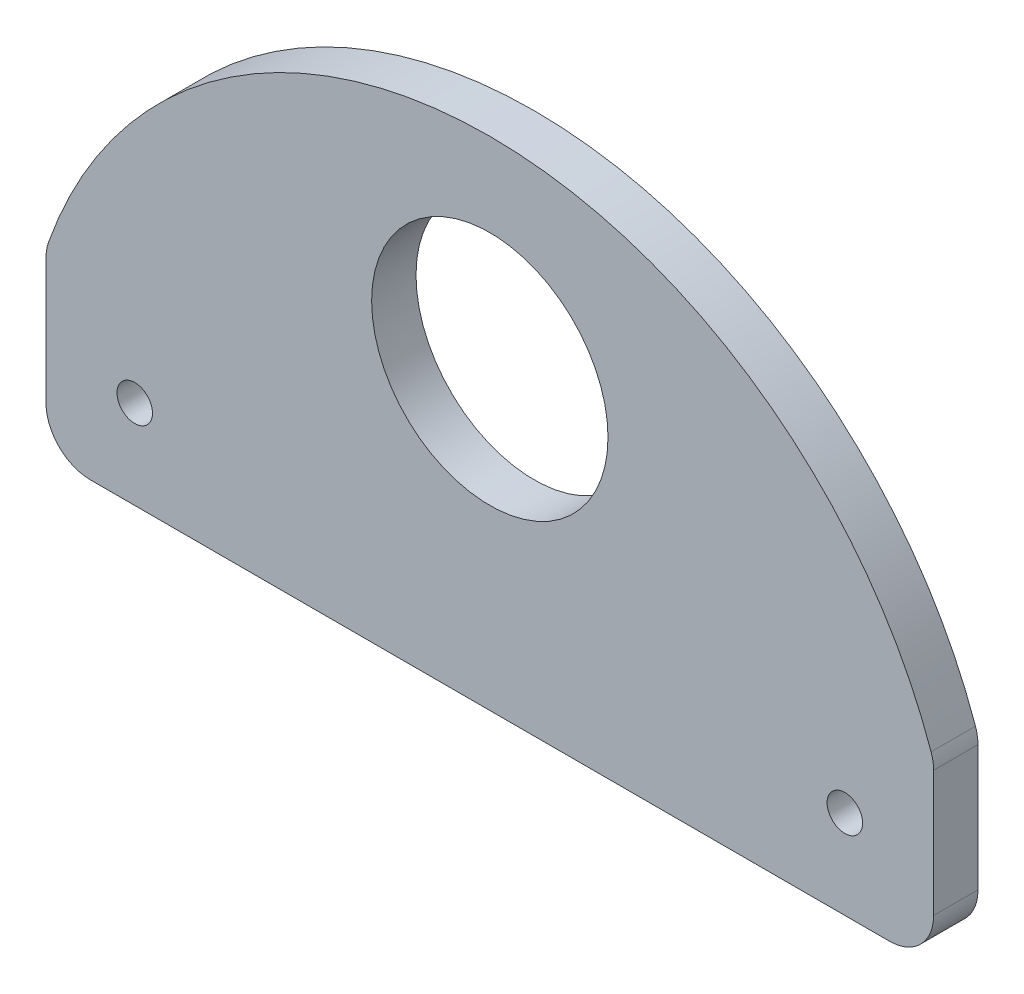
ISO-10303-21;
HEADER;
FILE_DESCRIPTION(('STEP AP214'),'2;1');
FILE_NAME('part.step','',(''),(''),'','','');
FILE_SCHEMA(('AUTOMOTIVE_DESIGN { 1 0 10303 214 1 1 1 1 }'));
ENDSEC;
DATA;
#1=APPLICATION_CONTEXT('core data for automotive mechanical design processes');
#2=APPLICATION_PROTOCOL_DEFINITION('international standard','automotive_design',2000,#1);
#3=PRODUCT_CONTEXT('',#1,'mechanical');
#4=PRODUCT('Part','Part','',(#3));
#5=PRODUCT_RELATED_PRODUCT_CATEGORY('part','',(#4));
#6=PRODUCT_DEFINITION_FORMATION('','',#4);
#7=PRODUCT_DEFINITION_CONTEXT('part definition',#1,'design');
#8=PRODUCT_DEFINITION('design','',#6,#7);
#9=PRODUCT_DEFINITION_SHAPE('','',#8);
#10=(LENGTH_UNIT() NAMED_UNIT(*) SI_UNIT(.MILLI.,.METRE.));
#11=(NAMED_UNIT(*) PLANE_ANGLE_UNIT() SI_UNIT($,.RADIAN.));
#12=(NAMED_UNIT(*) SI_UNIT($,.STERADIAN.) SOLID_ANGLE_UNIT());
#13=UNCERTAINTY_MEASURE_WITH_UNIT(LENGTH_MEASURE(1.E-05),#10,'distance_accuracy_value','');
#14=(GEOMETRIC_REPRESENTATION_CONTEXT(3) GLOBAL_UNCERTAINTY_ASSIGNED_CONTEXT((#13)) GLOBAL_UNIT_ASSIGNED_CONTEXT((#10,
#11,#12)) REPRESENTATION_CONTEXT('',''));
#15=CARTESIAN_POINT('',(0.,0.,0.));
#16=DIRECTION('',(0.,0.,1.));
#17=DIRECTION('',(1.,0.,0.));
#18=AXIS2_PLACEMENT_3D('',#15,#16,#17);
#19=CARTESIAN_POINT('',(0.,3.315,5.));
#20=DIRECTION('',(0.,0.,-1.));
#21=DIRECTION('',(-1.,0.,0.));
#22=AXIS2_PLACEMENT_3D('',#19,#20,#21);
#23=PLANE('',#22);
#24=DIRECTION('',(0.,1.,0.));
#25=VECTOR('',#24,1.);
#26=CARTESIAN_POINT('',(50.,20.,5.));
#27=LINE('',#26,#25);
#28=CARTESIAN_POINT('',(50.,5.,5.));
#29=VERTEX_POINT('',#28);
#30=CARTESIAN_POINT('',(50.,19.1669697362921,5.));
#31=VERTEX_POINT('',#30);
#32=EDGE_CURVE('E140',#29,#31,#27,.T.);
#33=ORIENTED_EDGE('',*,*,#32,.T.);
#34=CARTESIAN_POINT('',(45.,19.1669697362921,5.));
#35=DIRECTION('',(0.,0.,-1.));
#36=DIRECTION('',(-1.,0.,0.));
#37=AXIS2_PLACEMENT_3D('',#34,#35,#36);
#38=CIRCLE('',#37,5.);
#39=CARTESIAN_POINT('',(49.7159501435155,20.8282386019115,5.));
#40=VERTEX_POINT('',#39);
#41=EDGE_CURVE('E159',#31,#40,#38,.F.);
#42=ORIENTED_EDGE('',*,*,#41,.T.);
#43=CARTESIAN_POINT('',(0.,3.315,5.));
#44=DIRECTION('',(0.,0.,1.));
#45=DIRECTION('',(-1.,0.,0.));
#46=AXIS2_PLACEMENT_3D('',#43,#44,#45);
#47=CIRCLE('',#46,52.7104280479679);
#48=CARTESIAN_POINT('',(-49.7159501435155,20.8282386019115,5.));
#49=VERTEX_POINT('',#48);
#50=EDGE_CURVE('E123',#40,#49,#47,.T.);
#51=ORIENTED_EDGE('',*,*,#50,.T.);
#52=CARTESIAN_POINT('',(-45.,19.1669697362921,5.));
#53=DIRECTION('',(0.,0.,-1.));
#54=DIRECTION('',(-1.,0.,0.));
#55=AXIS2_PLACEMENT_3D('',#52,#53,#54);
#56=CIRCLE('',#55,5.);
#57=CARTESIAN_POINT('',(-50.,19.1669697362921,5.));
#58=VERTEX_POINT('',#57);
#59=EDGE_CURVE('E157',#49,#58,#56,.F.);
#60=ORIENTED_EDGE('',*,*,#59,.T.);
#61=DIRECTION('',(0.,-1.,0.));
#62=VECTOR('',#61,1.);
#63=CARTESIAN_POINT('',(-50.,20.,5.));
#64=LINE('',#63,#62);
#65=CARTESIAN_POINT('',(-50.,5.,5.));
#66=VERTEX_POINT('',#65);
#67=EDGE_CURVE('E170',#58,#66,#64,.T.);
#68=ORIENTED_EDGE('',*,*,#67,.T.);
#69=CARTESIAN_POINT('',(-45.,5.,5.));
#70=DIRECTION('',(0.,0.,-1.));
#71=DIRECTION('',(-1.,0.,0.));
#72=AXIS2_PLACEMENT_3D('',#69,#70,#71);
#73=CIRCLE('',#72,5.);
#74=CARTESIAN_POINT('',(-45.,0.,5.));
#75=VERTEX_POINT('',#74);
#76=EDGE_CURVE('E58',#66,#75,#73,.F.);
#77=ORIENTED_EDGE('',*,*,#76,.T.);
#78=DIRECTION('',(1.,0.,0.));
#79=VECTOR('',#78,1.);
#80=CARTESIAN_POINT('',(-50.,0.,5.));
#81=LINE('',#80,#79);
#82=CARTESIAN_POINT('',(45.,0.,5.));
#83=VERTEX_POINT('',#82);
#84=EDGE_CURVE('E178',#75,#83,#81,.T.);
#85=ORIENTED_EDGE('',*,*,#84,.T.);
#86=CARTESIAN_POINT('',(45.,5.,5.));
#87=DIRECTION('',(0.,0.,-1.));
#88=DIRECTION('',(-1.,0.,0.));
#89=AXIS2_PLACEMENT_3D('',#86,#87,#88);
#90=CIRCLE('',#89,5.);
#91=EDGE_CURVE('E154',#83,#29,#90,.F.);
#92=ORIENTED_EDGE('',*,*,#91,.T.);
#93=EDGE_LOOP('',(#33,#42,#51,#60,#68,#77,#85,#92));
#94=FACE_BOUND('',#93,.T.);
#95=CARTESIAN_POINT('',(-40.,10.,5.));
#96=DIRECTION('',(0.,0.,1.));
#97=DIRECTION('',(1.,0.,0.));
#98=AXIS2_PLACEMENT_3D('',#95,#96,#97);
#99=CIRCLE('',#98,2.);
#100=CARTESIAN_POINT('',(-38.,10.,5.));
#101=VERTEX_POINT('',#100);
#102=EDGE_CURVE('E131',#101,#101,#99,.T.);
#103=ORIENTED_EDGE('',*,*,#102,.F.);
#104=EDGE_LOOP('',(#103));
#105=FACE_BOUND('',#104,.T.);
#106=CARTESIAN_POINT('',(40.,10.,5.));
#107=DIRECTION('',(0.,0.,1.));
#108=DIRECTION('',(-1.,0.,0.));
#109=AXIS2_PLACEMENT_3D('',#106,#107,#108);
#110=CIRCLE('',#109,2.);
#111=CARTESIAN_POINT('',(38.,10.,5.));
#112=VERTEX_POINT('',#111);
#113=EDGE_CURVE('E185',#112,#112,#110,.T.);
#114=ORIENTED_EDGE('',*,*,#113,.F.);
#115=EDGE_LOOP('',(#114));
#116=FACE_BOUND('',#115,.T.);
#117=CARTESIAN_POINT('',(0.,33.315,5.));
#118=DIRECTION('',(0.,0.,1.));
#119=DIRECTION('',(1.,0.,0.));
#120=AXIS2_PLACEMENT_3D('',#117,#118,#119);
#121=CIRCLE('',#120,13.315);
#122=CARTESIAN_POINT('',(13.315,33.315,5.));
#123=VERTEX_POINT('',#122);
#124=EDGE_CURVE('E190',#123,#123,#121,.T.);
#125=ORIENTED_EDGE('',*,*,#124,.F.);
#126=EDGE_LOOP('',(#125));
#127=FACE_BOUND('',#126,.T.);
#128=ADVANCED_FACE('F37',(#94,#105,#116,#127),#23,.F.);
#129=CARTESIAN_POINT('',(0.,3.315,0.));
#130=DIRECTION('',(0.,0.,-1.));
#131=DIRECTION('',(-1.,0.,0.));
#132=AXIS2_PLACEMENT_3D('',#129,#130,#131);
#133=PLANE('',#132);
#134=CARTESIAN_POINT('',(40.,10.,0.));
#135=DIRECTION('',(0.,0.,1.));
#136=DIRECTION('',(-1.,0.,0.));
#137=AXIS2_PLACEMENT_3D('',#134,#135,#136);
#138=CIRCLE('',#137,2.);
#139=CARTESIAN_POINT('',(38.,10.,0.));
#140=VERTEX_POINT('',#139);
#141=EDGE_CURVE('E187',#140,#140,#138,.T.);
#142=ORIENTED_EDGE('',*,*,#141,.T.);
#143=EDGE_LOOP('',(#142));
#144=FACE_BOUND('',#143,.T.);
#145=CARTESIAN_POINT('',(0.,3.315,0.));
#146=DIRECTION('',(0.,0.,1.));
#147=DIRECTION('',(-1.,0.,0.));
#148=AXIS2_PLACEMENT_3D('',#145,#146,#147);
#149=CIRCLE('',#148,52.7104280479679);
#150=CARTESIAN_POINT('',(49.7159501435155,20.8282386019115,0.));
#151=VERTEX_POINT('',#150);
#152=CARTESIAN_POINT('',(-49.7159501435155,20.8282386019115,0.));
#153=VERTEX_POINT('',#152);
#154=EDGE_CURVE('E120',#151,#153,#149,.T.);
#155=ORIENTED_EDGE('',*,*,#154,.F.);
#156=CARTESIAN_POINT('',(45.,19.1669697362921,0.));
#157=DIRECTION('',(0.,0.,-1.));
#158=DIRECTION('',(-1.,0.,0.));
#159=AXIS2_PLACEMENT_3D('',#156,#157,#158);
#160=CIRCLE('',#159,5.);
#161=CARTESIAN_POINT('',(50.,19.1669697362921,0.));
#162=VERTEX_POINT('',#161);
#163=EDGE_CURVE('E103',#151,#162,#160,.T.);
#164=ORIENTED_EDGE('',*,*,#163,.T.);
#165=DIRECTION('',(0.,1.,0.));
#166=VECTOR('',#165,1.);
#167=CARTESIAN_POINT('',(50.,20.,0.));
#168=LINE('',#167,#166);
#169=CARTESIAN_POINT('',(50.,5.,0.));
#170=VERTEX_POINT('',#169);
#171=EDGE_CURVE('E144',#170,#162,#168,.T.);
#172=ORIENTED_EDGE('',*,*,#171,.F.);
#173=CARTESIAN_POINT('',(45.,5.,0.));
#174=DIRECTION('',(0.,0.,-1.));
#175=DIRECTION('',(-1.,0.,0.));
#176=AXIS2_PLACEMENT_3D('',#173,#174,#175);
#177=CIRCLE('',#176,5.);
#178=CARTESIAN_POINT('',(45.,0.,0.));
#179=VERTEX_POINT('',#178);
#180=EDGE_CURVE('E124',#170,#179,#177,.T.);
#181=ORIENTED_EDGE('',*,*,#180,.T.);
#182=DIRECTION('',(1.,0.,0.));
#183=VECTOR('',#182,1.);
#184=CARTESIAN_POINT('',(-50.,0.,0.));
#185=LINE('',#184,#183);
#186=CARTESIAN_POINT('',(-45.,0.,0.));
#187=VERTEX_POINT('',#186);
#188=EDGE_CURVE('E134',#187,#179,#185,.T.);
#189=ORIENTED_EDGE('',*,*,#188,.F.);
#190=CARTESIAN_POINT('',(-45.,5.,0.));
#191=DIRECTION('',(0.,0.,-1.));
#192=DIRECTION('',(-1.,0.,0.));
#193=AXIS2_PLACEMENT_3D('',#190,#191,#192);
#194=CIRCLE('',#193,5.);
#195=CARTESIAN_POINT('',(-50.,5.,0.));
#196=VERTEX_POINT('',#195);
#197=EDGE_CURVE('E148',#187,#196,#194,.T.);
#198=ORIENTED_EDGE('',*,*,#197,.T.);
#199=DIRECTION('',(0.,-1.,0.));
#200=VECTOR('',#199,1.);
#201=CARTESIAN_POINT('',(-50.,20.,0.));
#202=LINE('',#201,#200);
#203=CARTESIAN_POINT('',(-50.,19.1669697362921,0.));
#204=VERTEX_POINT('',#203);
#205=EDGE_CURVE('E130',#204,#196,#202,.T.);
#206=ORIENTED_EDGE('',*,*,#205,.F.);
#207=CARTESIAN_POINT('',(-45.,19.1669697362921,0.));
#208=DIRECTION('',(0.,0.,-1.));
#209=DIRECTION('',(-1.,0.,0.));
#210=AXIS2_PLACEMENT_3D('',#207,#208,#209);
#211=CIRCLE('',#210,5.);
#212=EDGE_CURVE('E114',#204,#153,#211,.T.);
#213=ORIENTED_EDGE('',*,*,#212,.T.);
#214=EDGE_LOOP('',(#155,#164,#172,#181,#189,#198,#206,#213));
#215=FACE_BOUND('',#214,.T.);
#216=CARTESIAN_POINT('',(-40.,10.,0.));
#217=DIRECTION('',(0.,0.,1.));
#218=DIRECTION('',(1.,0.,0.));
#219=AXIS2_PLACEMENT_3D('',#216,#217,#218);
#220=CIRCLE('',#219,2.);
#221=CARTESIAN_POINT('',(-38.,10.,0.));
#222=VERTEX_POINT('',#221);
#223=EDGE_CURVE('E137',#222,#222,#220,.T.);
#224=ORIENTED_EDGE('',*,*,#223,.T.);
#225=EDGE_LOOP('',(#224));
#226=FACE_BOUND('',#225,.T.);
#227=CARTESIAN_POINT('',(0.,33.315,0.));
#228=DIRECTION('',(0.,0.,1.));
#229=DIRECTION('',(1.,0.,0.));
#230=AXIS2_PLACEMENT_3D('',#227,#228,#229);
#231=CIRCLE('',#230,13.315);
#232=CARTESIAN_POINT('',(13.315,33.315,0.));
#233=VERTEX_POINT('',#232);
#234=EDGE_CURVE('E193',#233,#233,#231,.T.);
#235=ORIENTED_EDGE('',*,*,#234,.T.);
#236=EDGE_LOOP('',(#235));
#237=FACE_BOUND('',#236,.T.);
#238=ADVANCED_FACE('F127',(#144,#215,#226,#237),#133,.T.);
#239=CARTESIAN_POINT('',(0.,3.315,5.));
#240=DIRECTION('',(0.,0.,-1.));
#241=DIRECTION('',(-1.,0.,0.));
#242=AXIS2_PLACEMENT_3D('',#239,#240,#241);
#243=CYLINDRICAL_SURFACE('',#242,52.7104280479679);
#244=ORIENTED_EDGE('',*,*,#50,.F.);
#245=DIRECTION('',(0.,0.,-1.));
#246=VECTOR('',#245,1.);
#247=CARTESIAN_POINT('',(49.7159501435155,20.8282386019115,5.));
#248=LINE('',#247,#246);
#249=EDGE_CURVE('E107',#40,#151,#248,.T.);
#250=ORIENTED_EDGE('',*,*,#249,.T.);
#251=ORIENTED_EDGE('',*,*,#154,.T.);
#252=DIRECTION('',(0.,0.,-1.));
#253=VECTOR('',#252,1.);
#254=CARTESIAN_POINT('',(-49.7159501435155,20.8282386019115,5.));
#255=LINE('',#254,#253);
#256=EDGE_CURVE('E125',#153,#49,#255,.F.);
#257=ORIENTED_EDGE('',*,*,#256,.T.);
#258=EDGE_LOOP('',(#244,#250,#251,#257));
#259=FACE_BOUND('',#258,.T.);
#260=ADVANCED_FACE('F119',(#259),#243,.T.);
#261=CARTESIAN_POINT('',(-50.,20.,5.));
#262=DIRECTION('',(1.,0.,0.));
#263=DIRECTION('',(0.,0.,-1.));
#264=AXIS2_PLACEMENT_3D('',#261,#262,#263);
#265=PLANE('',#264);
#266=ORIENTED_EDGE('',*,*,#67,.F.);
#267=DIRECTION('',(0.,0.,-1.));
#268=VECTOR('',#267,1.);
#269=CARTESIAN_POINT('',(-50.,19.1669697362921,5.));
#270=LINE('',#269,#268);
#271=EDGE_CURVE('E163',#58,#204,#270,.T.);
#272=ORIENTED_EDGE('',*,*,#271,.T.);
#273=ORIENTED_EDGE('',*,*,#205,.T.);
#274=DIRECTION('',(0.,0.,-1.));
#275=VECTOR('',#274,1.);
#276=CARTESIAN_POINT('',(-50.,5.,5.));
#277=LINE('',#276,#275);
#278=EDGE_CURVE('E161',#196,#66,#277,.F.);
#279=ORIENTED_EDGE('',*,*,#278,.T.);
#280=EDGE_LOOP('',(#266,#272,#273,#279));
#281=FACE_BOUND('',#280,.T.);
#282=ADVANCED_FACE('F168',(#281),#265,.F.);
#283=CARTESIAN_POINT('',(-50.,0.,5.));
#284=DIRECTION('',(0.,1.,0.));
#285=DIRECTION('',(0.,0.,1.));
#286=AXIS2_PLACEMENT_3D('',#283,#284,#285);
#287=PLANE('',#286);
#288=ORIENTED_EDGE('',*,*,#84,.F.);
#289=DIRECTION('',(0.,0.,-1.));
#290=VECTOR('',#289,1.);
#291=CARTESIAN_POINT('',(-45.,0.,5.));
#292=LINE('',#291,#290);
#293=EDGE_CURVE('E11',#75,#187,#292,.T.);
#294=ORIENTED_EDGE('',*,*,#293,.T.);
#295=ORIENTED_EDGE('',*,*,#188,.T.);
#296=DIRECTION('',(0.,0.,-1.));
#297=VECTOR('',#296,1.);
#298=CARTESIAN_POINT('',(45.,0.,5.));
#299=LINE('',#298,#297);
#300=EDGE_CURVE('E45',#179,#83,#299,.F.);
#301=ORIENTED_EDGE('',*,*,#300,.T.);
#302=EDGE_LOOP('',(#288,#294,#295,#301));
#303=FACE_BOUND('',#302,.T.);
#304=ADVANCED_FACE('F177',(#303),#287,.F.);
#305=CARTESIAN_POINT('',(50.,20.,5.));
#306=DIRECTION('',(-1.,0.,0.));
#307=DIRECTION('',(0.,0.,1.));
#308=AXIS2_PLACEMENT_3D('',#305,#306,#307);
#309=PLANE('',#308);
#310=ORIENTED_EDGE('',*,*,#171,.T.);
#311=DIRECTION('',(0.,0.,-1.));
#312=VECTOR('',#311,1.);
#313=CARTESIAN_POINT('',(50.,19.1669697362921,5.));
#314=LINE('',#313,#312);
#315=EDGE_CURVE('E108',#162,#31,#314,.F.);
#316=ORIENTED_EDGE('',*,*,#315,.T.);
#317=ORIENTED_EDGE('',*,*,#32,.F.);
#318=DIRECTION('',(0.,0.,-1.));
#319=VECTOR('',#318,1.);
#320=CARTESIAN_POINT('',(50.,5.,5.));
#321=LINE('',#320,#319);
#322=EDGE_CURVE('E113',#29,#170,#321,.T.);
#323=ORIENTED_EDGE('',*,*,#322,.T.);
#324=EDGE_LOOP('',(#310,#316,#317,#323));
#325=FACE_BOUND('',#324,.T.);
#326=ADVANCED_FACE('F214',(#325),#309,.F.);
#327=CARTESIAN_POINT('',(-40.,10.,5.));
#328=DIRECTION('',(0.,0.,-1.));
#329=DIRECTION('',(-1.,0.,0.));
#330=AXIS2_PLACEMENT_3D('',#327,#328,#329);
#331=CYLINDRICAL_SURFACE('',#330,2.);
#332=ORIENTED_EDGE('',*,*,#102,.T.);
#333=EDGE_LOOP('',(#332));
#334=FACE_BOUND('',#333,.T.);
#335=ORIENTED_EDGE('',*,*,#223,.F.);
#336=EDGE_LOOP('',(#335));
#337=FACE_BOUND('',#336,.T.);
#338=ADVANCED_FACE('F211',(#334,#337),#331,.F.);
#339=CARTESIAN_POINT('',(40.,10.,5.));
#340=DIRECTION('',(0.,0.,-1.));
#341=DIRECTION('',(-1.,0.,0.));
#342=AXIS2_PLACEMENT_3D('',#339,#340,#341);
#343=CYLINDRICAL_SURFACE('',#342,2.);
#344=ORIENTED_EDGE('',*,*,#113,.T.);
#345=EDGE_LOOP('',(#344));
#346=FACE_BOUND('',#345,.T.);
#347=ORIENTED_EDGE('',*,*,#141,.F.);
#348=EDGE_LOOP('',(#347));
#349=FACE_BOUND('',#348,.T.);
#350=ADVANCED_FACE('F308',(#346,#349),#343,.F.);
#351=CARTESIAN_POINT('',(0.,33.315,5.));
#352=DIRECTION('',(0.,0.,-1.));
#353=DIRECTION('',(-1.,0.,0.));
#354=AXIS2_PLACEMENT_3D('',#351,#352,#353);
#355=CYLINDRICAL_SURFACE('',#354,13.315);
#356=ORIENTED_EDGE('',*,*,#124,.T.);
#357=EDGE_LOOP('',(#356));
#358=FACE_BOUND('',#357,.T.);
#359=ORIENTED_EDGE('',*,*,#234,.F.);
#360=EDGE_LOOP('',(#359));
#361=FACE_BOUND('',#360,.T.);
#362=ADVANCED_FACE('F199',(#358,#361),#355,.F.);
#363=CARTESIAN_POINT('',(45.,19.1669697362921,5.));
#364=DIRECTION('',(0.,0.,-1.));
#365=DIRECTION('',(-1.,0.,0.));
#366=AXIS2_PLACEMENT_3D('',#363,#364,#365);
#367=CYLINDRICAL_SURFACE('',#366,5.);
#368=ORIENTED_EDGE('',*,*,#41,.F.);
#369=ORIENTED_EDGE('',*,*,#315,.F.);
#370=ORIENTED_EDGE('',*,*,#163,.F.);
#371=ORIENTED_EDGE('',*,*,#249,.F.);
#372=EDGE_LOOP('',(#368,#369,#370,#371));
#373=FACE_BOUND('',#372,.T.);
#374=ADVANCED_FACE('F106',(#373),#367,.T.);
#375=CARTESIAN_POINT('',(-45.,19.1669697362921,5.));
#376=DIRECTION('',(0.,0.,-1.));
#377=DIRECTION('',(-1.,0.,0.));
#378=AXIS2_PLACEMENT_3D('',#375,#376,#377);
#379=CYLINDRICAL_SURFACE('',#378,5.);
#380=ORIENTED_EDGE('',*,*,#59,.F.);
#381=ORIENTED_EDGE('',*,*,#256,.F.);
#382=ORIENTED_EDGE('',*,*,#212,.F.);
#383=ORIENTED_EDGE('',*,*,#271,.F.);
#384=EDGE_LOOP('',(#380,#381,#382,#383));
#385=FACE_BOUND('',#384,.T.);
#386=ADVANCED_FACE('F226',(#385),#379,.T.);
#387=CARTESIAN_POINT('',(-45.,5.,5.));
#388=DIRECTION('',(0.,0.,-1.));
#389=DIRECTION('',(-1.,0.,0.));
#390=AXIS2_PLACEMENT_3D('',#387,#388,#389);
#391=CYLINDRICAL_SURFACE('',#390,5.);
#392=ORIENTED_EDGE('',*,*,#76,.F.);
#393=ORIENTED_EDGE('',*,*,#278,.F.);
#394=ORIENTED_EDGE('',*,*,#197,.F.);
#395=ORIENTED_EDGE('',*,*,#293,.F.);
#396=EDGE_LOOP('',(#392,#393,#394,#395));
#397=FACE_BOUND('',#396,.T.);
#398=ADVANCED_FACE('F176',(#397),#391,.T.);
#399=CARTESIAN_POINT('',(45.,5.,5.));
#400=DIRECTION('',(0.,0.,-1.));
#401=DIRECTION('',(-1.,0.,0.));
#402=AXIS2_PLACEMENT_3D('',#399,#400,#401);
#403=CYLINDRICAL_SURFACE('',#402,5.);
#404=ORIENTED_EDGE('',*,*,#91,.F.);
#405=ORIENTED_EDGE('',*,*,#300,.F.);
#406=ORIENTED_EDGE('',*,*,#180,.F.);
#407=ORIENTED_EDGE('',*,*,#322,.F.);
#408=EDGE_LOOP('',(#404,#405,#406,#407));
#409=FACE_BOUND('',#408,.T.);
#410=ADVANCED_FACE('F39',(#409),#403,.T.);
#411=CLOSED_SHELL('',(#128,#238,#260,#282,#304,#326,#338,#350,#362,#374,#386,#398,#410));
#412=MANIFOLD_SOLID_BREP('B2',#411);
#413=ADVANCED_BREP_SHAPE_REPRESENTATION('',(#18,#412),#14);
#414=SHAPE_DEFINITION_REPRESENTATION(#9,#413);
ENDSEC;
END-ISO-10303-21;
